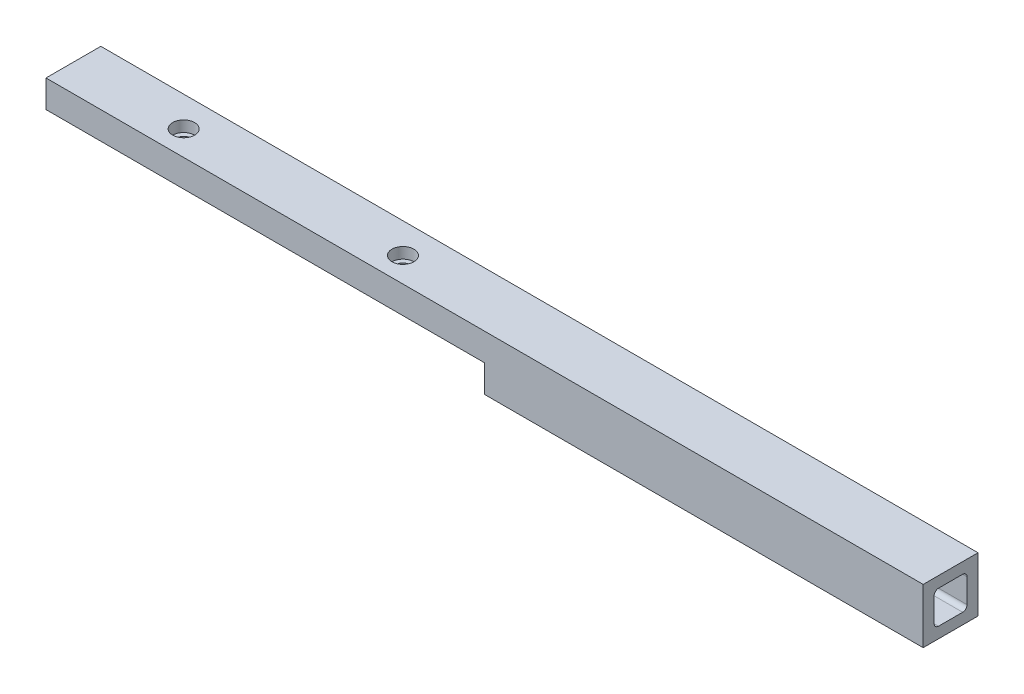
ISO-10303-21;
HEADER;
FILE_DESCRIPTION(('STEP AP214'),'2;1');
FILE_NAME('part.step','',(''),(''),'','','');
FILE_SCHEMA(('AUTOMOTIVE_DESIGN { 1 0 10303 214 1 1 1 1 }'));
ENDSEC;
DATA;
#1=APPLICATION_CONTEXT('core data for automotive mechanical design processes');
#2=APPLICATION_PROTOCOL_DEFINITION('international standard','automotive_design',2000,#1);
#3=PRODUCT_CONTEXT('',#1,'mechanical');
#4=PRODUCT('Part','Part','',(#3));
#5=PRODUCT_RELATED_PRODUCT_CATEGORY('part','',(#4));
#6=PRODUCT_DEFINITION_FORMATION('','',#4);
#7=PRODUCT_DEFINITION_CONTEXT('part definition',#1,'design');
#8=PRODUCT_DEFINITION('design','',#6,#7);
#9=PRODUCT_DEFINITION_SHAPE('','',#8);
#10=(LENGTH_UNIT() NAMED_UNIT(*) SI_UNIT(.MILLI.,.METRE.));
#11=(NAMED_UNIT(*) PLANE_ANGLE_UNIT() SI_UNIT($,.RADIAN.));
#12=(NAMED_UNIT(*) SI_UNIT($,.STERADIAN.) SOLID_ANGLE_UNIT());
#13=UNCERTAINTY_MEASURE_WITH_UNIT(LENGTH_MEASURE(1.E-05),#10,'distance_accuracy_value','');
#14=(GEOMETRIC_REPRESENTATION_CONTEXT(3) GLOBAL_UNCERTAINTY_ASSIGNED_CONTEXT((#13)) GLOBAL_UNIT_ASSIGNED_CONTEXT((#10,
#11,#12)) REPRESENTATION_CONTEXT('',''));
#15=CARTESIAN_POINT('',(0.,0.,0.));
#16=DIRECTION('',(0.,0.,1.));
#17=DIRECTION('',(1.,0.,0.));
#18=AXIS2_PLACEMENT_3D('',#15,#16,#17);
#19=CARTESIAN_POINT('',(135.886266753297,-328.191488077078,30.6295855642618));
#20=DIRECTION('',(0.,1.,0.));
#21=DIRECTION('',(0.,0.,1.));
#22=AXIS2_PLACEMENT_3D('',#19,#20,#21);
#23=CYLINDRICAL_SURFACE('',#22,1.75000000000001);
#24=CARTESIAN_POINT('',(135.886266753297,92.5,30.6295855642618));
#25=DIRECTION('',(0.,-1.,0.));
#26=DIRECTION('',(0.,0.,-1.));
#27=AXIS2_PLACEMENT_3D('',#24,#25,#26);
#28=CIRCLE('',#27,1.75000000000001);
#29=CARTESIAN_POINT('',(135.886266753297,92.5,28.8795855642618));
#30=VERTEX_POINT('',#29);
#31=EDGE_CURVE('E224',#30,#30,#28,.T.);
#32=ORIENTED_EDGE('',*,*,#31,.T.);
#33=EDGE_LOOP('',(#32));
#34=FACE_BOUND('',#33,.T.);
#35=CARTESIAN_POINT('',(135.886266753297,97.,30.6295855642618));
#36=DIRECTION('',(0.,1.,0.));
#37=DIRECTION('',(0.,0.,1.));
#38=AXIS2_PLACEMENT_3D('',#35,#36,#37);
#39=CIRCLE('',#38,1.75000000000001);
#40=CARTESIAN_POINT('',(135.886266753297,97.,32.3795855642619));
#41=VERTEX_POINT('',#40);
#42=EDGE_CURVE('E43',#41,#41,#39,.F.);
#43=ORIENTED_EDGE('',*,*,#42,.F.);
#44=EDGE_LOOP('',(#43));
#45=FACE_BOUND('',#44,.T.);
#46=ADVANCED_FACE('F39',(#34,#45),#23,.F.);
#47=CARTESIAN_POINT('',(195.886266753297,-328.191488077078,30.6295855642618));
#48=DIRECTION('',(0.,1.,0.));
#49=DIRECTION('',(0.,0.,1.));
#50=AXIS2_PLACEMENT_3D('',#47,#48,#49);
#51=CYLINDRICAL_SURFACE('',#50,1.75000000000001);
#52=CARTESIAN_POINT('',(195.886266753297,92.5,30.6295855642618));
#53=DIRECTION('',(0.,-1.,0.));
#54=DIRECTION('',(0.,0.,-1.));
#55=AXIS2_PLACEMENT_3D('',#52,#53,#54);
#56=CIRCLE('',#55,1.75000000000001);
#57=CARTESIAN_POINT('',(195.886266753297,92.5,28.8795855642618));
#58=VERTEX_POINT('',#57);
#59=EDGE_CURVE('E250',#58,#58,#56,.T.);
#60=ORIENTED_EDGE('',*,*,#59,.T.);
#61=EDGE_LOOP('',(#60));
#62=FACE_BOUND('',#61,.T.);
#63=CARTESIAN_POINT('',(195.886266753297,97.,30.6295855642618));
#64=DIRECTION('',(0.,1.,0.));
#65=DIRECTION('',(0.,0.,1.));
#66=AXIS2_PLACEMENT_3D('',#63,#64,#65);
#67=CIRCLE('',#66,1.75000000000001);
#68=CARTESIAN_POINT('',(195.886266753297,97.,32.3795855642619));
#69=VERTEX_POINT('',#68);
#70=EDGE_CURVE('E240',#69,#69,#67,.F.);
#71=ORIENTED_EDGE('',*,*,#70,.F.);
#72=EDGE_LOOP('',(#71));
#73=FACE_BOUND('',#72,.T.);
#74=ADVANCED_FACE('F332',(#62,#73),#51,.F.);
#75=CARTESIAN_POINT('',(225.,92.5,22.39));
#76=DIRECTION('',(-1.,0.,0.));
#77=DIRECTION('',(0.,0.,1.));
#78=AXIS2_PLACEMENT_3D('',#75,#76,#77);
#79=PLANE('',#78);
#80=DIRECTION('',(0.,0.,1.));
#81=VECTOR('',#80,1.);
#82=CARTESIAN_POINT('',(225.,92.5,22.39));
#83=LINE('',#82,#81);
#84=CARTESIAN_POINT('',(225.,92.5,22.4));
#85=VERTEX_POINT('',#84);
#86=CARTESIAN_POINT('',(225.,92.5,37.4));
#87=VERTEX_POINT('',#86);
#88=EDGE_CURVE('E11',#85,#87,#83,.T.);
#89=ORIENTED_EDGE('',*,*,#88,.F.);
#90=DIRECTION('',(0.,-1.,0.));
#91=VECTOR('',#90,1.);
#92=CARTESIAN_POINT('',(225.,85.,22.4));
#93=LINE('',#92,#91);
#94=CARTESIAN_POINT('',(225.,85.,22.4));
#95=VERTEX_POINT('',#94);
#96=EDGE_CURVE('E220',#85,#95,#93,.T.);
#97=ORIENTED_EDGE('',*,*,#96,.T.);
#98=DIRECTION('',(0.,0.,1.));
#99=VECTOR('',#98,1.);
#100=CARTESIAN_POINT('',(225.,85.,22.4));
#101=LINE('',#100,#99);
#102=CARTESIAN_POINT('',(225.,85.,37.4));
#103=VERTEX_POINT('',#102);
#104=EDGE_CURVE('E208',#95,#103,#101,.T.);
#105=ORIENTED_EDGE('',*,*,#104,.T.);
#106=DIRECTION('',(0.,1.,0.));
#107=VECTOR('',#106,1.);
#108=CARTESIAN_POINT('',(225.,85.,37.4));
#109=LINE('',#108,#107);
#110=EDGE_CURVE('E204',#103,#87,#109,.T.);
#111=ORIENTED_EDGE('',*,*,#110,.T.);
#112=EDGE_LOOP('',(#89,#97,#105,#111));
#113=FACE_BOUND('',#112,.T.);
#114=ADVANCED_FACE('F338',(#113),#79,.T.);
#115=CARTESIAN_POINT('',(105.,92.5,22.39));
#116=DIRECTION('',(0.,-1.,0.));
#117=DIRECTION('',(0.,0.,-1.));
#118=AXIS2_PLACEMENT_3D('',#115,#116,#117);
#119=PLANE('',#118);
#120=ORIENTED_EDGE('',*,*,#59,.F.);
#121=EDGE_LOOP('',(#120));
#122=FACE_BOUND('',#121,.T.);
#123=ORIENTED_EDGE('',*,*,#31,.F.);
#124=EDGE_LOOP('',(#123));
#125=FACE_BOUND('',#124,.T.);
#126=DIRECTION('',(0.,0.,1.));
#127=VECTOR('',#126,1.);
#128=CARTESIAN_POINT('',(105.,92.5,22.39));
#129=LINE('',#128,#127);
#130=CARTESIAN_POINT('',(105.,92.5,22.4));
#131=VERTEX_POINT('',#130);
#132=CARTESIAN_POINT('',(105.,92.5,37.4));
#133=VERTEX_POINT('',#132);
#134=EDGE_CURVE('E50',#131,#133,#129,.T.);
#135=ORIENTED_EDGE('',*,*,#134,.F.);
#136=DIRECTION('',(1.,0.,0.));
#137=VECTOR('',#136,1.);
#138=CARTESIAN_POINT('',(-36.2132034355964,92.5,22.4));
#139=LINE('',#138,#137);
#140=EDGE_CURVE('E216',#131,#85,#139,.T.);
#141=ORIENTED_EDGE('',*,*,#140,.T.);
#142=ORIENTED_EDGE('',*,*,#88,.T.);
#143=DIRECTION('',(-1.,0.,0.));
#144=VECTOR('',#143,1.);
#145=CARTESIAN_POINT('',(-36.2132034355964,92.5,37.4));
#146=LINE('',#145,#144);
#147=EDGE_CURVE('E200',#87,#133,#146,.T.);
#148=ORIENTED_EDGE('',*,*,#147,.T.);
#149=EDGE_LOOP('',(#135,#141,#142,#148));
#150=FACE_BOUND('',#149,.T.);
#151=ADVANCED_FACE('F482',(#122,#125,#150),#119,.T.);
#152=CARTESIAN_POINT('',(105.,100.,22.39));
#153=DIRECTION('',(-1.,0.,0.));
#154=DIRECTION('',(0.,0.,1.));
#155=AXIS2_PLACEMENT_3D('',#152,#153,#154);
#156=PLANE('',#155);
#157=DIRECTION('',(0.,0.,-1.));
#158=VECTOR('',#157,1.);
#159=CARTESIAN_POINT('',(105.,100.,22.4));
#160=LINE('',#159,#158);
#161=CARTESIAN_POINT('',(105.,100.,37.4));
#162=VERTEX_POINT('',#161);
#163=CARTESIAN_POINT('',(105.,100.,22.4));
#164=VERTEX_POINT('',#163);
#165=EDGE_CURVE('E191',#162,#164,#160,.T.);
#166=ORIENTED_EDGE('',*,*,#165,.T.);
#167=DIRECTION('',(0.,-1.,0.));
#168=VECTOR('',#167,1.);
#169=CARTESIAN_POINT('',(105.,85.,22.4));
#170=LINE('',#169,#168);
#171=EDGE_CURVE('E212',#164,#131,#170,.T.);
#172=ORIENTED_EDGE('',*,*,#171,.T.);
#173=ORIENTED_EDGE('',*,*,#134,.T.);
#174=DIRECTION('',(0.,1.,0.));
#175=VECTOR('',#174,1.);
#176=CARTESIAN_POINT('',(105.,85.,37.4));
#177=LINE('',#176,#175);
#178=EDGE_CURVE('E196',#133,#162,#177,.T.);
#179=ORIENTED_EDGE('',*,*,#178,.T.);
#180=EDGE_LOOP('',(#166,#172,#173,#179));
#181=FACE_BOUND('',#180,.T.);
#182=ADVANCED_FACE('F380',(#181),#156,.T.);
#183=CARTESIAN_POINT('',(-36.2132034355964,100.,22.4));
#184=DIRECTION('',(0.,-1.,0.));
#185=DIRECTION('',(0.,0.,-1.));
#186=AXIS2_PLACEMENT_3D('',#183,#184,#185);
#187=PLANE('',#186);
#188=CARTESIAN_POINT('',(195.886266753297,100.,30.6295855642618));
#189=DIRECTION('',(0.,1.,0.));
#190=DIRECTION('',(0.,0.,1.));
#191=AXIS2_PLACEMENT_3D('',#188,#189,#190);
#192=CIRCLE('',#191,2.99999999999999);
#193=CARTESIAN_POINT('',(195.886266753297,100.,33.6295855642618));
#194=VERTEX_POINT('',#193);
#195=EDGE_CURVE('E243',#194,#194,#192,.T.);
#196=ORIENTED_EDGE('',*,*,#195,.F.);
#197=EDGE_LOOP('',(#196));
#198=FACE_BOUND('',#197,.T.);
#199=CARTESIAN_POINT('',(135.886266753297,100.,30.6295855642618));
#200=DIRECTION('',(0.,1.,0.));
#201=DIRECTION('',(0.,0.,1.));
#202=AXIS2_PLACEMENT_3D('',#199,#200,#201);
#203=CIRCLE('',#202,2.99999999999999);
#204=CARTESIAN_POINT('',(135.886266753297,100.,33.6295855642618));
#205=VERTEX_POINT('',#204);
#206=EDGE_CURVE('E259',#205,#205,#203,.T.);
#207=ORIENTED_EDGE('',*,*,#206,.F.);
#208=EDGE_LOOP('',(#207));
#209=FACE_BOUND('',#208,.T.);
#210=ORIENTED_EDGE('',*,*,#165,.F.);
#211=DIRECTION('',(1.,0.,0.));
#212=VECTOR('',#211,1.);
#213=CARTESIAN_POINT('',(-36.2132034355964,100.,37.4));
#214=LINE('',#213,#212);
#215=CARTESIAN_POINT('',(345.,100.,37.4));
#216=VERTEX_POINT('',#215);
#217=EDGE_CURVE('E232',#162,#216,#214,.T.);
#218=ORIENTED_EDGE('',*,*,#217,.T.);
#219=DIRECTION('',(0.,0.,-1.));
#220=VECTOR('',#219,1.);
#221=CARTESIAN_POINT('',(345.,100.,22.4));
#222=LINE('',#221,#220);
#223=CARTESIAN_POINT('',(345.,100.,22.4));
#224=VERTEX_POINT('',#223);
#225=EDGE_CURVE('E239',#216,#224,#222,.T.);
#226=ORIENTED_EDGE('',*,*,#225,.T.);
#227=DIRECTION('',(1.,0.,0.));
#228=VECTOR('',#227,1.);
#229=CARTESIAN_POINT('',(-36.2132034355964,100.,22.4));
#230=LINE('',#229,#228);
#231=EDGE_CURVE('E236',#164,#224,#230,.T.);
#232=ORIENTED_EDGE('',*,*,#231,.F.);
#233=EDGE_LOOP('',(#210,#218,#226,#232));
#234=FACE_BOUND('',#233,.T.);
#235=ADVANCED_FACE('F341',(#198,#209,#234),#187,.F.);
#236=CARTESIAN_POINT('',(-36.2132034355964,85.,37.4));
#237=DIRECTION('',(0.,0.,-1.));
#238=DIRECTION('',(-1.,0.,0.));
#239=AXIS2_PLACEMENT_3D('',#236,#237,#238);
#240=PLANE('',#239);
#241=ORIENTED_EDGE('',*,*,#178,.F.);
#242=ORIENTED_EDGE('',*,*,#147,.F.);
#243=ORIENTED_EDGE('',*,*,#110,.F.);
#244=DIRECTION('',(1.,0.,0.));
#245=VECTOR('',#244,1.);
#246=CARTESIAN_POINT('',(-36.2132034355964,85.,37.4));
#247=LINE('',#246,#245);
#248=CARTESIAN_POINT('',(345.,85.,37.4));
#249=VERTEX_POINT('',#248);
#250=EDGE_CURVE('E228',#103,#249,#247,.T.);
#251=ORIENTED_EDGE('',*,*,#250,.T.);
#252=DIRECTION('',(0.,1.,0.));
#253=VECTOR('',#252,1.);
#254=CARTESIAN_POINT('',(345.,85.,37.4));
#255=LINE('',#254,#253);
#256=EDGE_CURVE('E278',#249,#216,#255,.T.);
#257=ORIENTED_EDGE('',*,*,#256,.T.);
#258=ORIENTED_EDGE('',*,*,#217,.F.);
#259=EDGE_LOOP('',(#241,#242,#243,#251,#257,#258));
#260=FACE_BOUND('',#259,.T.);
#261=ADVANCED_FACE('F450',(#260),#240,.F.);
#262=CARTESIAN_POINT('',(-36.2132034355964,85.,22.4));
#263=DIRECTION('',(0.,1.,0.));
#264=DIRECTION('',(0.,0.,1.));
#265=AXIS2_PLACEMENT_3D('',#262,#263,#264);
#266=PLANE('',#265);
#267=ORIENTED_EDGE('',*,*,#104,.F.);
#268=DIRECTION('',(1.,0.,0.));
#269=VECTOR('',#268,1.);
#270=CARTESIAN_POINT('',(-36.2132034355964,85.,22.4));
#271=LINE('',#270,#269);
#272=CARTESIAN_POINT('',(345.,85.,22.4));
#273=VERTEX_POINT('',#272);
#274=EDGE_CURVE('E195',#95,#273,#271,.T.);
#275=ORIENTED_EDGE('',*,*,#274,.T.);
#276=DIRECTION('',(0.,0.,1.));
#277=VECTOR('',#276,1.);
#278=CARTESIAN_POINT('',(345.,85.,22.4));
#279=LINE('',#278,#277);
#280=EDGE_CURVE('E282',#273,#249,#279,.T.);
#281=ORIENTED_EDGE('',*,*,#280,.T.);
#282=ORIENTED_EDGE('',*,*,#250,.F.);
#283=EDGE_LOOP('',(#267,#275,#281,#282));
#284=FACE_BOUND('',#283,.T.);
#285=ADVANCED_FACE('F439',(#284),#266,.F.);
#286=CARTESIAN_POINT('',(-36.2132034355964,85.,22.4));
#287=DIRECTION('',(0.,0.,1.));
#288=DIRECTION('',(1.,0.,0.));
#289=AXIS2_PLACEMENT_3D('',#286,#287,#288);
#290=PLANE('',#289);
#291=ORIENTED_EDGE('',*,*,#171,.F.);
#292=ORIENTED_EDGE('',*,*,#231,.T.);
#293=DIRECTION('',(0.,-1.,0.));
#294=VECTOR('',#293,1.);
#295=CARTESIAN_POINT('',(345.,85.,22.4));
#296=LINE('',#295,#294);
#297=EDGE_CURVE('E286',#224,#273,#296,.T.);
#298=ORIENTED_EDGE('',*,*,#297,.T.);
#299=ORIENTED_EDGE('',*,*,#274,.F.);
#300=ORIENTED_EDGE('',*,*,#96,.F.);
#301=ORIENTED_EDGE('',*,*,#140,.F.);
#302=EDGE_LOOP('',(#291,#292,#298,#299,#300,#301));
#303=FACE_BOUND('',#302,.T.);
#304=ADVANCED_FACE('F41',(#303),#290,.F.);
#305=CARTESIAN_POINT('',(345.,0.,0.));
#306=DIRECTION('',(1.,0.,0.));
#307=DIRECTION('',(0.,0.,-1.));
#308=AXIS2_PLACEMENT_3D('',#305,#306,#307);
#309=PLANE('',#308);
#310=CARTESIAN_POINT('',(345.,89.2,26.6));
#311=DIRECTION('',(1.,0.,0.));
#312=DIRECTION('',(0.,0.,1.));
#313=AXIS2_PLACEMENT_3D('',#310,#311,#312);
#314=CIRCLE('',#313,1.2);
#315=CARTESIAN_POINT('',(345.,88.,26.6));
#316=VERTEX_POINT('',#315);
#317=CARTESIAN_POINT('',(345.,89.2,25.4));
#318=VERTEX_POINT('',#317);
#319=EDGE_CURVE('E155',#316,#318,#314,.T.);
#320=ORIENTED_EDGE('',*,*,#319,.F.);
#321=DIRECTION('',(0.,0.,-1.));
#322=VECTOR('',#321,1.);
#323=CARTESIAN_POINT('',(345.,88.,33.2));
#324=LINE('',#323,#322);
#325=CARTESIAN_POINT('',(345.,88.,33.2));
#326=VERTEX_POINT('',#325);
#327=EDGE_CURVE('E186',#326,#316,#324,.T.);
#328=ORIENTED_EDGE('',*,*,#327,.F.);
#329=CARTESIAN_POINT('',(345.,89.2,33.2));
#330=DIRECTION('',(1.,0.,0.));
#331=DIRECTION('',(0.,0.,-1.));
#332=AXIS2_PLACEMENT_3D('',#329,#330,#331);
#333=CIRCLE('',#332,1.2);
#334=CARTESIAN_POINT('',(345.,89.2,34.4));
#335=VERTEX_POINT('',#334);
#336=EDGE_CURVE('E146',#335,#326,#333,.T.);
#337=ORIENTED_EDGE('',*,*,#336,.F.);
#338=DIRECTION('',(0.,-1.,0.));
#339=VECTOR('',#338,1.);
#340=CARTESIAN_POINT('',(345.,95.8,34.4));
#341=LINE('',#340,#339);
#342=CARTESIAN_POINT('',(345.,95.8,34.4));
#343=VERTEX_POINT('',#342);
#344=EDGE_CURVE('E141',#343,#335,#341,.T.);
#345=ORIENTED_EDGE('',*,*,#344,.F.);
#346=CARTESIAN_POINT('',(345.,95.8,33.2));
#347=DIRECTION('',(1.,0.,0.));
#348=DIRECTION('',(0.,0.,-1.));
#349=AXIS2_PLACEMENT_3D('',#346,#347,#348);
#350=CIRCLE('',#349,1.2);
#351=CARTESIAN_POINT('',(345.,97.,33.2));
#352=VERTEX_POINT('',#351);
#353=EDGE_CURVE('E117',#352,#343,#350,.T.);
#354=ORIENTED_EDGE('',*,*,#353,.F.);
#355=DIRECTION('',(0.,0.,1.));
#356=VECTOR('',#355,1.);
#357=CARTESIAN_POINT('',(345.,97.,26.6));
#358=LINE('',#357,#356);
#359=CARTESIAN_POINT('',(345.,97.,26.6));
#360=VERTEX_POINT('',#359);
#361=EDGE_CURVE('E129',#360,#352,#358,.T.);
#362=ORIENTED_EDGE('',*,*,#361,.F.);
#363=CARTESIAN_POINT('',(345.,95.8,26.6));
#364=DIRECTION('',(1.,0.,0.));
#365=DIRECTION('',(0.,0.,-1.));
#366=AXIS2_PLACEMENT_3D('',#363,#364,#365);
#367=CIRCLE('',#366,1.2);
#368=CARTESIAN_POINT('',(345.,95.8,25.4));
#369=VERTEX_POINT('',#368);
#370=EDGE_CURVE('E134',#369,#360,#367,.T.);
#371=ORIENTED_EDGE('',*,*,#370,.F.);
#372=DIRECTION('',(0.,1.,0.));
#373=VECTOR('',#372,1.);
#374=CARTESIAN_POINT('',(345.,89.2,25.4));
#375=LINE('',#374,#373);
#376=EDGE_CURVE('E152',#318,#369,#375,.T.);
#377=ORIENTED_EDGE('',*,*,#376,.F.);
#378=EDGE_LOOP('',(#320,#328,#337,#345,#354,#362,#371,#377));
#379=FACE_BOUND('',#378,.T.);
#380=ORIENTED_EDGE('',*,*,#297,.F.);
#381=ORIENTED_EDGE('',*,*,#225,.F.);
#382=ORIENTED_EDGE('',*,*,#256,.F.);
#383=ORIENTED_EDGE('',*,*,#280,.F.);
#384=EDGE_LOOP('',(#380,#381,#382,#383));
#385=FACE_BOUND('',#384,.T.);
#386=ADVANCED_FACE('F137',(#379,#385),#309,.T.);
#387=CARTESIAN_POINT('',(335.,89.2,26.6));
#388=DIRECTION('',(1.,0.,0.));
#389=DIRECTION('',(0.,0.,-1.));
#390=AXIS2_PLACEMENT_3D('',#387,#388,#389);
#391=CYLINDRICAL_SURFACE('',#390,1.2);
#392=ORIENTED_EDGE('',*,*,#319,.T.);
#393=DIRECTION('',(1.,0.,0.));
#394=VECTOR('',#393,1.);
#395=CARTESIAN_POINT('',(335.,89.2,25.4));
#396=LINE('',#395,#394);
#397=CARTESIAN_POINT('',(335.,89.2,25.4));
#398=VERTEX_POINT('',#397);
#399=EDGE_CURVE('E93',#398,#318,#396,.T.);
#400=ORIENTED_EDGE('',*,*,#399,.F.);
#401=CARTESIAN_POINT('',(335.,89.2,26.6));
#402=DIRECTION('',(1.,0.,0.));
#403=DIRECTION('',(0.,0.,1.));
#404=AXIS2_PLACEMENT_3D('',#401,#402,#403);
#405=CIRCLE('',#404,1.2);
#406=CARTESIAN_POINT('',(335.,88.,26.6));
#407=VERTEX_POINT('',#406);
#408=EDGE_CURVE('E183',#407,#398,#405,.T.);
#409=ORIENTED_EDGE('',*,*,#408,.F.);
#410=DIRECTION('',(1.,0.,0.));
#411=VECTOR('',#410,1.);
#412=CARTESIAN_POINT('',(335.,88.,26.6));
#413=LINE('',#412,#411);
#414=EDGE_CURVE('E97',#407,#316,#413,.T.);
#415=ORIENTED_EDGE('',*,*,#414,.T.);
#416=EDGE_LOOP('',(#392,#400,#409,#415));
#417=FACE_BOUND('',#416,.T.);
#418=ADVANCED_FACE('F347',(#417),#391,.F.);
#419=CARTESIAN_POINT('',(335.,88.,33.2));
#420=DIRECTION('',(0.,-1.,0.));
#421=DIRECTION('',(0.,0.,-1.));
#422=AXIS2_PLACEMENT_3D('',#419,#420,#421);
#423=PLANE('',#422);
#424=ORIENTED_EDGE('',*,*,#327,.T.);
#425=ORIENTED_EDGE('',*,*,#414,.F.);
#426=DIRECTION('',(0.,0.,-1.));
#427=VECTOR('',#426,1.);
#428=CARTESIAN_POINT('',(335.,88.,33.2));
#429=LINE('',#428,#427);
#430=CARTESIAN_POINT('',(335.,88.,33.2));
#431=VERTEX_POINT('',#430);
#432=EDGE_CURVE('E158',#431,#407,#429,.T.);
#433=ORIENTED_EDGE('',*,*,#432,.F.);
#434=DIRECTION('',(1.,0.,0.));
#435=VECTOR('',#434,1.);
#436=CARTESIAN_POINT('',(335.,88.,33.2));
#437=LINE('',#436,#435);
#438=EDGE_CURVE('E301',#431,#326,#437,.T.);
#439=ORIENTED_EDGE('',*,*,#438,.T.);
#440=EDGE_LOOP('',(#424,#425,#433,#439));
#441=FACE_BOUND('',#440,.T.);
#442=ADVANCED_FACE('F316',(#441),#423,.F.);
#443=CARTESIAN_POINT('',(335.,89.2,33.2));
#444=DIRECTION('',(1.,0.,0.));
#445=DIRECTION('',(0.,0.,-1.));
#446=AXIS2_PLACEMENT_3D('',#443,#444,#445);
#447=CYLINDRICAL_SURFACE('',#446,1.2);
#448=ORIENTED_EDGE('',*,*,#336,.T.);
#449=ORIENTED_EDGE('',*,*,#438,.F.);
#450=CARTESIAN_POINT('',(335.,89.2,33.2));
#451=DIRECTION('',(1.,0.,0.));
#452=DIRECTION('',(0.,0.,-1.));
#453=AXIS2_PLACEMENT_3D('',#450,#451,#452);
#454=CIRCLE('',#453,1.2);
#455=CARTESIAN_POINT('',(335.,89.2,34.4));
#456=VERTEX_POINT('',#455);
#457=EDGE_CURVE('E162',#456,#431,#454,.T.);
#458=ORIENTED_EDGE('',*,*,#457,.F.);
#459=DIRECTION('',(1.,0.,0.));
#460=VECTOR('',#459,1.);
#461=CARTESIAN_POINT('',(335.,89.2,34.4));
#462=LINE('',#461,#460);
#463=EDGE_CURVE('E298',#456,#335,#462,.T.);
#464=ORIENTED_EDGE('',*,*,#463,.T.);
#465=EDGE_LOOP('',(#448,#449,#458,#464));
#466=FACE_BOUND('',#465,.T.);
#467=ADVANCED_FACE('F312',(#466),#447,.F.);
#468=CARTESIAN_POINT('',(335.,95.8,34.4));
#469=DIRECTION('',(0.,0.,1.));
#470=DIRECTION('',(1.,0.,0.));
#471=AXIS2_PLACEMENT_3D('',#468,#469,#470);
#472=PLANE('',#471);
#473=ORIENTED_EDGE('',*,*,#344,.T.);
#474=ORIENTED_EDGE('',*,*,#463,.F.);
#475=DIRECTION('',(0.,-1.,0.));
#476=VECTOR('',#475,1.);
#477=CARTESIAN_POINT('',(335.,95.8,34.4));
#478=LINE('',#477,#476);
#479=CARTESIAN_POINT('',(335.,95.8,34.4));
#480=VERTEX_POINT('',#479);
#481=EDGE_CURVE('E166',#480,#456,#478,.T.);
#482=ORIENTED_EDGE('',*,*,#481,.F.);
#483=DIRECTION('',(1.,0.,0.));
#484=VECTOR('',#483,1.);
#485=CARTESIAN_POINT('',(335.,95.8,34.4));
#486=LINE('',#485,#484);
#487=EDGE_CURVE('E126',#480,#343,#486,.T.);
#488=ORIENTED_EDGE('',*,*,#487,.T.);
#489=EDGE_LOOP('',(#473,#474,#482,#488));
#490=FACE_BOUND('',#489,.T.);
#491=ADVANCED_FACE('F322',(#490),#472,.F.);
#492=CARTESIAN_POINT('',(335.,95.8,33.2));
#493=DIRECTION('',(1.,0.,0.));
#494=DIRECTION('',(0.,0.,-1.));
#495=AXIS2_PLACEMENT_3D('',#492,#493,#494);
#496=CYLINDRICAL_SURFACE('',#495,1.2);
#497=ORIENTED_EDGE('',*,*,#353,.T.);
#498=ORIENTED_EDGE('',*,*,#487,.F.);
#499=CARTESIAN_POINT('',(335.,95.8,33.2));
#500=DIRECTION('',(1.,0.,0.));
#501=DIRECTION('',(0.,0.,-1.));
#502=AXIS2_PLACEMENT_3D('',#499,#500,#501);
#503=CIRCLE('',#502,1.2);
#504=CARTESIAN_POINT('',(335.,97.,33.2));
#505=VERTEX_POINT('',#504);
#506=EDGE_CURVE('E120',#505,#480,#503,.T.);
#507=ORIENTED_EDGE('',*,*,#506,.F.);
#508=DIRECTION('',(1.,0.,0.));
#509=VECTOR('',#508,1.);
#510=CARTESIAN_POINT('',(335.,97.,33.2));
#511=LINE('',#510,#509);
#512=EDGE_CURVE('E113',#505,#352,#511,.T.);
#513=ORIENTED_EDGE('',*,*,#512,.T.);
#514=EDGE_LOOP('',(#497,#498,#507,#513));
#515=FACE_BOUND('',#514,.T.);
#516=ADVANCED_FACE('F115',(#515),#496,.F.);
#517=CARTESIAN_POINT('',(335.,97.,26.6));
#518=DIRECTION('',(0.,1.,0.));
#519=DIRECTION('',(0.,0.,1.));
#520=AXIS2_PLACEMENT_3D('',#517,#518,#519);
#521=PLANE('',#520);
#522=ORIENTED_EDGE('',*,*,#361,.T.);
#523=ORIENTED_EDGE('',*,*,#512,.F.);
#524=DIRECTION('',(0.,0.,1.));
#525=VECTOR('',#524,1.);
#526=CARTESIAN_POINT('',(335.,97.,26.6));
#527=LINE('',#526,#525);
#528=CARTESIAN_POINT('',(335.,97.,26.6));
#529=VERTEX_POINT('',#528);
#530=EDGE_CURVE('E172',#529,#505,#527,.T.);
#531=ORIENTED_EDGE('',*,*,#530,.F.);
#532=DIRECTION('',(1.,0.,0.));
#533=VECTOR('',#532,1.);
#534=CARTESIAN_POINT('',(335.,97.,26.6));
#535=LINE('',#534,#533);
#536=EDGE_CURVE('E125',#529,#360,#535,.T.);
#537=ORIENTED_EDGE('',*,*,#536,.T.);
#538=EDGE_LOOP('',(#522,#523,#531,#537));
#539=FACE_BOUND('',#538,.T.);
#540=ADVANCED_FACE('F130',(#539),#521,.F.);
#541=CARTESIAN_POINT('',(335.,95.8,26.6));
#542=DIRECTION('',(1.,0.,0.));
#543=DIRECTION('',(0.,0.,-1.));
#544=AXIS2_PLACEMENT_3D('',#541,#542,#543);
#545=CYLINDRICAL_SURFACE('',#544,1.2);
#546=ORIENTED_EDGE('',*,*,#370,.T.);
#547=ORIENTED_EDGE('',*,*,#536,.F.);
#548=CARTESIAN_POINT('',(335.,95.8,26.6));
#549=DIRECTION('',(1.,0.,0.));
#550=DIRECTION('',(0.,0.,-1.));
#551=AXIS2_PLACEMENT_3D('',#548,#549,#550);
#552=CIRCLE('',#551,1.2);
#553=CARTESIAN_POINT('',(335.,95.8,25.4));
#554=VERTEX_POINT('',#553);
#555=EDGE_CURVE('E175',#554,#529,#552,.T.);
#556=ORIENTED_EDGE('',*,*,#555,.F.);
#557=DIRECTION('',(1.,0.,0.));
#558=VECTOR('',#557,1.);
#559=CARTESIAN_POINT('',(335.,95.8,25.4));
#560=LINE('',#559,#558);
#561=EDGE_CURVE('E59',#554,#369,#560,.T.);
#562=ORIENTED_EDGE('',*,*,#561,.T.);
#563=EDGE_LOOP('',(#546,#547,#556,#562));
#564=FACE_BOUND('',#563,.T.);
#565=ADVANCED_FACE('F353',(#564),#545,.F.);
#566=CARTESIAN_POINT('',(335.,89.2,25.4));
#567=DIRECTION('',(0.,0.,-1.));
#568=DIRECTION('',(-1.,0.,0.));
#569=AXIS2_PLACEMENT_3D('',#566,#567,#568);
#570=PLANE('',#569);
#571=ORIENTED_EDGE('',*,*,#376,.T.);
#572=ORIENTED_EDGE('',*,*,#561,.F.);
#573=DIRECTION('',(0.,1.,0.));
#574=VECTOR('',#573,1.);
#575=CARTESIAN_POINT('',(335.,89.2,25.4));
#576=LINE('',#575,#574);
#577=EDGE_CURVE('E179',#398,#554,#576,.T.);
#578=ORIENTED_EDGE('',*,*,#577,.F.);
#579=ORIENTED_EDGE('',*,*,#399,.T.);
#580=EDGE_LOOP('',(#571,#572,#578,#579));
#581=FACE_BOUND('',#580,.T.);
#582=ADVANCED_FACE('F350',(#581),#570,.F.);
#583=CARTESIAN_POINT('',(335.,89.2,26.6));
#584=DIRECTION('',(-1.,0.,0.));
#585=DIRECTION('',(0.,0.,1.));
#586=AXIS2_PLACEMENT_3D('',#583,#584,#585);
#587=PLANE('',#586);
#588=ORIENTED_EDGE('',*,*,#408,.T.);
#589=ORIENTED_EDGE('',*,*,#577,.T.);
#590=ORIENTED_EDGE('',*,*,#555,.T.);
#591=ORIENTED_EDGE('',*,*,#530,.T.);
#592=ORIENTED_EDGE('',*,*,#506,.T.);
#593=ORIENTED_EDGE('',*,*,#481,.T.);
#594=ORIENTED_EDGE('',*,*,#457,.T.);
#595=ORIENTED_EDGE('',*,*,#432,.T.);
#596=EDGE_LOOP('',(#588,#589,#590,#591,#592,#593,#594,#595));
#597=FACE_BOUND('',#596,.T.);
#598=ADVANCED_FACE('F319',(#597),#587,.F.);
#599=CARTESIAN_POINT('',(195.886266753297,97.,30.6295855642618));
#600=DIRECTION('',(0.,1.,0.));
#601=DIRECTION('',(0.,0.,1.));
#602=AXIS2_PLACEMENT_3D('',#599,#600,#601);
#603=PLANE('',#602);
#604=CARTESIAN_POINT('',(195.886266753297,97.,30.6295855642618));
#605=DIRECTION('',(0.,1.,0.));
#606=DIRECTION('',(0.,0.,1.));
#607=AXIS2_PLACEMENT_3D('',#604,#605,#606);
#608=CIRCLE('',#607,2.99999999999999);
#609=CARTESIAN_POINT('',(195.886266753297,97.,33.6295855642618));
#610=VERTEX_POINT('',#609);
#611=EDGE_CURVE('E252',#610,#610,#608,.T.);
#612=ORIENTED_EDGE('',*,*,#611,.T.);
#613=EDGE_LOOP('',(#612));
#614=FACE_BOUND('',#613,.T.);
#615=ORIENTED_EDGE('',*,*,#70,.T.);
#616=EDGE_LOOP('',(#615));
#617=FACE_BOUND('',#616,.T.);
#618=ADVANCED_FACE('F378',(#614,#617),#603,.T.);
#619=CARTESIAN_POINT('',(195.886266753297,97.,30.6295855642618));
#620=DIRECTION('',(0.,1.,0.));
#621=DIRECTION('',(0.,0.,1.));
#622=AXIS2_PLACEMENT_3D('',#619,#620,#621);
#623=CYLINDRICAL_SURFACE('',#622,2.99999999999999);
#624=ORIENTED_EDGE('',*,*,#611,.F.);
#625=EDGE_LOOP('',(#624));
#626=FACE_BOUND('',#625,.T.);
#627=ORIENTED_EDGE('',*,*,#195,.T.);
#628=EDGE_LOOP('',(#627));
#629=FACE_BOUND('',#628,.T.);
#630=ADVANCED_FACE('F387',(#626,#629),#623,.F.);
#631=CARTESIAN_POINT('',(135.886266753297,97.,30.6295855642618));
#632=DIRECTION('',(0.,1.,0.));
#633=DIRECTION('',(0.,0.,1.));
#634=AXIS2_PLACEMENT_3D('',#631,#632,#633);
#635=PLANE('',#634);
#636=CARTESIAN_POINT('',(135.886266753297,97.,30.6295855642618));
#637=DIRECTION('',(0.,1.,0.));
#638=DIRECTION('',(0.,0.,1.));
#639=AXIS2_PLACEMENT_3D('',#636,#637,#638);
#640=CIRCLE('',#639,2.99999999999999);
#641=CARTESIAN_POINT('',(135.886266753297,97.,33.6295855642618));
#642=VERTEX_POINT('',#641);
#643=EDGE_CURVE('E265',#642,#642,#640,.T.);
#644=ORIENTED_EDGE('',*,*,#643,.T.);
#645=EDGE_LOOP('',(#644));
#646=FACE_BOUND('',#645,.T.);
#647=ORIENTED_EDGE('',*,*,#42,.T.);
#648=EDGE_LOOP('',(#647));
#649=FACE_BOUND('',#648,.T.);
#650=ADVANCED_FACE('F396',(#646,#649),#635,.T.);
#651=CARTESIAN_POINT('',(135.886266753297,97.,30.6295855642618));
#652=DIRECTION('',(0.,1.,0.));
#653=DIRECTION('',(0.,0.,1.));
#654=AXIS2_PLACEMENT_3D('',#651,#652,#653);
#655=CYLINDRICAL_SURFACE('',#654,2.99999999999999);
#656=ORIENTED_EDGE('',*,*,#643,.F.);
#657=EDGE_LOOP('',(#656));
#658=FACE_BOUND('',#657,.T.);
#659=ORIENTED_EDGE('',*,*,#206,.T.);
#660=EDGE_LOOP('',(#659));
#661=FACE_BOUND('',#660,.T.);
#662=ADVANCED_FACE('F405',(#658,#661),#655,.F.);
#663=CLOSED_SHELL('',(#46,#74,#114,#151,#182,#235,#261,#285,#304,#386,#418,#442,#467,#491,#516,
#540,#565,#582,#598,#618,#630,#650,#662));
#664=MANIFOLD_SOLID_BREP('B2',#663);
#665=ADVANCED_BREP_SHAPE_REPRESENTATION('',(#18,#664),#14);
#666=SHAPE_DEFINITION_REPRESENTATION(#9,#665);
ENDSEC;
END-ISO-10303-21;
